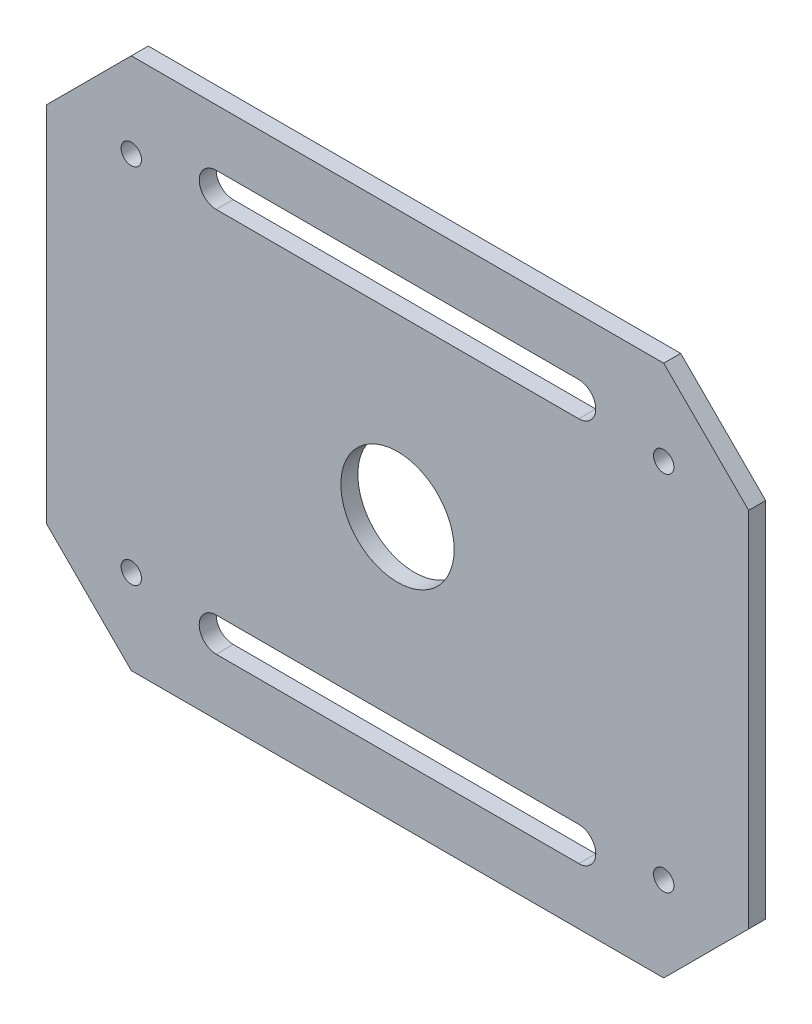
ISO-10303-21;
HEADER;
FILE_DESCRIPTION(('STEP AP214'),'2;1');
FILE_NAME('part.step','',(''),(''),'','','');
FILE_SCHEMA(('AUTOMOTIVE_DESIGN { 1 0 10303 214 1 1 1 1 }'));
ENDSEC;
DATA;
#1=APPLICATION_CONTEXT('core data for automotive mechanical design processes');
#2=APPLICATION_PROTOCOL_DEFINITION('international standard','automotive_design',2000,#1);
#3=PRODUCT_CONTEXT('',#1,'mechanical');
#4=PRODUCT('Part','Part','',(#3));
#5=PRODUCT_RELATED_PRODUCT_CATEGORY('part','',(#4));
#6=PRODUCT_DEFINITION_FORMATION('','',#4);
#7=PRODUCT_DEFINITION_CONTEXT('part definition',#1,'design');
#8=PRODUCT_DEFINITION('design','',#6,#7);
#9=PRODUCT_DEFINITION_SHAPE('','',#8);
#10=(LENGTH_UNIT() NAMED_UNIT(*) SI_UNIT(.MILLI.,.METRE.));
#11=(NAMED_UNIT(*) PLANE_ANGLE_UNIT() SI_UNIT($,.RADIAN.));
#12=(NAMED_UNIT(*) SI_UNIT($,.STERADIAN.) SOLID_ANGLE_UNIT());
#13=UNCERTAINTY_MEASURE_WITH_UNIT(LENGTH_MEASURE(1.E-05),#10,'distance_accuracy_value','');
#14=(GEOMETRIC_REPRESENTATION_CONTEXT(3) GLOBAL_UNCERTAINTY_ASSIGNED_CONTEXT((#13)) GLOBAL_UNIT_ASSIGNED_CONTEXT((#10,
#11,#12)) REPRESENTATION_CONTEXT('',''));
#15=CARTESIAN_POINT('',(0.,0.,0.));
#16=DIRECTION('',(0.,0.,1.));
#17=DIRECTION('',(1.,0.,0.));
#18=AXIS2_PLACEMENT_3D('',#15,#16,#17);
#19=CARTESIAN_POINT('',(0.,0.,3.));
#20=DIRECTION('',(0.,0.,1.));
#21=DIRECTION('',(1.,0.,0.));
#22=AXIS2_PLACEMENT_3D('',#19,#20,#21);
#23=PLANE('',#22);
#24=CARTESIAN_POINT('',(-24.9574088553855,-107.544565590663,3.));
#25=DIRECTION('',(0.,0.,1.));
#26=DIRECTION('',(1.,0.,0.));
#27=AXIS2_PLACEMENT_3D('',#24,#25,#26);
#28=CIRCLE('',#27,1.8);
#29=CARTESIAN_POINT('',(-23.1574088553855,-107.544565590663,3.));
#30=VERTEX_POINT('',#29);
#31=EDGE_CURVE('E411',#30,#30,#28,.T.);
#32=ORIENTED_EDGE('',*,*,#31,.F.);
#33=EDGE_LOOP('',(#32));
#34=FACE_BOUND('',#33,.T.);
#35=CARTESIAN_POINT('',(69.0425911446145,-43.5445655906625,3.));
#36=DIRECTION('',(0.,0.,1.));
#37=DIRECTION('',(1.,0.,0.));
#38=AXIS2_PLACEMENT_3D('',#35,#36,#37);
#39=CIRCLE('',#38,1.80000000000001);
#40=CARTESIAN_POINT('',(70.8425911446145,-43.5445655906625,3.));
#41=VERTEX_POINT('',#40);
#42=EDGE_CURVE('E423',#41,#41,#39,.T.);
#43=ORIENTED_EDGE('',*,*,#42,.F.);
#44=EDGE_LOOP('',(#43));
#45=FACE_BOUND('',#44,.T.);
#46=DIRECTION('',(1.,0.,0.));
#47=VECTOR('',#46,1.);
#48=CARTESIAN_POINT('',(54.0509267940495,-112.544565590663,3.));
#49=LINE('',#48,#47);
#50=CARTESIAN_POINT('',(-9.96574450482058,-112.544565590663,3.));
#51=VERTEX_POINT('',#50);
#52=CARTESIAN_POINT('',(54.0509267940495,-112.544565590663,3.));
#53=VERTEX_POINT('',#52);
#54=EDGE_CURVE('E160',#51,#53,#49,.T.);
#55=ORIENTED_EDGE('',*,*,#54,.F.);
#56=CARTESIAN_POINT('',(-9.96574450482058,-109.544565590663,3.));
#57=DIRECTION('',(0.,0.,1.));
#58=DIRECTION('',(1.,0.,0.));
#59=AXIS2_PLACEMENT_3D('',#56,#57,#58);
#60=CIRCLE('',#59,2.99999999999999);
#61=CARTESIAN_POINT('',(-9.96574450482058,-106.544565590663,3.));
#62=VERTEX_POINT('',#61);
#63=EDGE_CURVE('E152',#62,#51,#60,.T.);
#64=ORIENTED_EDGE('',*,*,#63,.F.);
#65=DIRECTION('',(-1.,0.,0.));
#66=VECTOR('',#65,1.);
#67=CARTESIAN_POINT('',(-9.96574450482058,-106.544565590663,3.));
#68=LINE('',#67,#66);
#69=CARTESIAN_POINT('',(54.0509267940495,-106.544565590663,3.));
#70=VERTEX_POINT('',#69);
#71=EDGE_CURVE('E175',#70,#62,#68,.T.);
#72=ORIENTED_EDGE('',*,*,#71,.F.);
#73=CARTESIAN_POINT('',(54.0509267940496,-109.544565590663,3.));
#74=DIRECTION('',(0.,0.,1.));
#75=DIRECTION('',(1.,0.,0.));
#76=AXIS2_PLACEMENT_3D('',#73,#74,#75);
#77=CIRCLE('',#76,2.99999999999999);
#78=EDGE_CURVE('E173',#53,#70,#77,.T.);
#79=ORIENTED_EDGE('',*,*,#78,.F.);
#80=EDGE_LOOP('',(#55,#64,#72,#79));
#81=FACE_BOUND('',#80,.T.);
#82=DIRECTION('',(1.,0.,0.));
#83=VECTOR('',#82,1.);
#84=CARTESIAN_POINT('',(-9.95740885538553,-44.5445655906625,3.));
#85=LINE('',#84,#83);
#86=CARTESIAN_POINT('',(-9.95740885538553,-44.5445655906625,3.));
#87=VERTEX_POINT('',#86);
#88=CARTESIAN_POINT('',(54.0425911446145,-44.5445655906625,3.));
#89=VERTEX_POINT('',#88);
#90=EDGE_CURVE('E193',#87,#89,#85,.T.);
#91=ORIENTED_EDGE('',*,*,#90,.F.);
#92=CARTESIAN_POINT('',(-9.95740885538553,-41.5445655906625,3.));
#93=DIRECTION('',(0.,0.,1.));
#94=DIRECTION('',(1.,0.,0.));
#95=AXIS2_PLACEMENT_3D('',#92,#93,#94);
#96=CIRCLE('',#95,2.99999999999999);
#97=CARTESIAN_POINT('',(-9.95740885538553,-38.5445655906625,3.));
#98=VERTEX_POINT('',#97);
#99=EDGE_CURVE('E191',#98,#87,#96,.T.);
#100=ORIENTED_EDGE('',*,*,#99,.F.);
#101=DIRECTION('',(-1.,0.,0.));
#102=VECTOR('',#101,1.);
#103=CARTESIAN_POINT('',(-9.95740885538553,-38.5445655906625,3.));
#104=LINE('',#103,#102);
#105=CARTESIAN_POINT('',(54.0425911446145,-38.5445655906625,3.));
#106=VERTEX_POINT('',#105);
#107=EDGE_CURVE('E199',#106,#98,#104,.T.);
#108=ORIENTED_EDGE('',*,*,#107,.F.);
#109=CARTESIAN_POINT('',(54.0425911446145,-41.5445655906625,3.));
#110=DIRECTION('',(0.,0.,1.));
#111=DIRECTION('',(1.,0.,0.));
#112=AXIS2_PLACEMENT_3D('',#109,#110,#111);
#113=CIRCLE('',#112,2.99999999999999);
#114=EDGE_CURVE('E196',#89,#106,#113,.T.);
#115=ORIENTED_EDGE('',*,*,#114,.F.);
#116=EDGE_LOOP('',(#91,#100,#108,#115));
#117=FACE_BOUND('',#116,.T.);
#118=DIRECTION('',(0.,-1.,0.));
#119=VECTOR('',#118,1.);
#120=CARTESIAN_POINT('',(-39.9574088553855,-43.5445655906625,3.));
#121=LINE('',#120,#119);
#122=CARTESIAN_POINT('',(-39.9574088553855,-43.5445655906625,3.));
#123=VERTEX_POINT('',#122);
#124=CARTESIAN_POINT('',(-39.9574088553855,-107.544565590663,3.));
#125=VERTEX_POINT('',#124);
#126=EDGE_CURVE('E222',#123,#125,#121,.T.);
#127=ORIENTED_EDGE('',*,*,#126,.T.);
#128=DIRECTION('',(0.707106781186548,-0.707106781186547,0.));
#129=VECTOR('',#128,1.);
#130=CARTESIAN_POINT('',(-39.9574088553855,-107.544565590663,3.));
#131=LINE('',#130,#129);
#132=CARTESIAN_POINT('',(-24.9574088553855,-122.544565590663,3.));
#133=VERTEX_POINT('',#132);
#134=EDGE_CURVE('E225',#125,#133,#131,.T.);
#135=ORIENTED_EDGE('',*,*,#134,.T.);
#136=DIRECTION('',(1.,0.,0.));
#137=VECTOR('',#136,1.);
#138=CARTESIAN_POINT('',(-24.9574088553855,-122.544565590663,3.));
#139=LINE('',#138,#137);
#140=CARTESIAN_POINT('',(69.0425911446145,-122.544565590663,3.));
#141=VERTEX_POINT('',#140);
#142=EDGE_CURVE('E228',#133,#141,#139,.T.);
#143=ORIENTED_EDGE('',*,*,#142,.T.);
#144=DIRECTION('',(0.707106781186547,0.707106781186548,0.));
#145=VECTOR('',#144,1.);
#146=CARTESIAN_POINT('',(69.0425911446145,-122.544565590663,3.));
#147=LINE('',#146,#145);
#148=CARTESIAN_POINT('',(84.0425911446145,-107.544565590663,3.));
#149=VERTEX_POINT('',#148);
#150=EDGE_CURVE('E230',#141,#149,#147,.T.);
#151=ORIENTED_EDGE('',*,*,#150,.T.);
#152=DIRECTION('',(0.,1.,0.));
#153=VECTOR('',#152,1.);
#154=CARTESIAN_POINT('',(84.0425911446145,-43.5445655906625,3.));
#155=LINE('',#154,#153);
#156=CARTESIAN_POINT('',(84.0425911446145,-43.5445655906625,3.));
#157=VERTEX_POINT('',#156);
#158=EDGE_CURVE('E232',#149,#157,#155,.T.);
#159=ORIENTED_EDGE('',*,*,#158,.T.);
#160=DIRECTION('',(-0.707106781186547,0.707106781186548,0.));
#161=VECTOR('',#160,1.);
#162=CARTESIAN_POINT('',(69.0425911446145,-28.5445655906625,3.));
#163=LINE('',#162,#161);
#164=CARTESIAN_POINT('',(69.0425911446145,-28.5445655906625,3.));
#165=VERTEX_POINT('',#164);
#166=EDGE_CURVE('E234',#157,#165,#163,.T.);
#167=ORIENTED_EDGE('',*,*,#166,.T.);
#168=DIRECTION('',(-1.,0.,0.));
#169=VECTOR('',#168,1.);
#170=CARTESIAN_POINT('',(-24.9574088553855,-28.5445655906625,3.));
#171=LINE('',#170,#169);
#172=CARTESIAN_POINT('',(-24.9574088553855,-28.5445655906625,3.));
#173=VERTEX_POINT('',#172);
#174=EDGE_CURVE('E236',#165,#173,#171,.T.);
#175=ORIENTED_EDGE('',*,*,#174,.T.);
#176=DIRECTION('',(-0.707106781186547,-0.707106781186548,0.));
#177=VECTOR('',#176,1.);
#178=CARTESIAN_POINT('',(-39.9574088553855,-43.5445655906625,3.));
#179=LINE('',#178,#177);
#180=EDGE_CURVE('E238',#173,#123,#179,.T.);
#181=ORIENTED_EDGE('',*,*,#180,.T.);
#182=EDGE_LOOP('',(#127,#135,#143,#151,#159,#167,#175,#181));
#183=FACE_BOUND('',#182,.T.);
#184=CARTESIAN_POINT('',(-24.9574088553855,-43.5445655906625,3.));
#185=DIRECTION('',(0.,0.,1.));
#186=DIRECTION('',(1.,0.,0.));
#187=AXIS2_PLACEMENT_3D('',#184,#185,#186);
#188=CIRCLE('',#187,1.8);
#189=CARTESIAN_POINT('',(-23.1574088553855,-43.5445655906625,3.));
#190=VERTEX_POINT('',#189);
#191=EDGE_CURVE('E181',#190,#190,#188,.T.);
#192=ORIENTED_EDGE('',*,*,#191,.F.);
#193=EDGE_LOOP('',(#192));
#194=FACE_BOUND('',#193,.T.);
#195=CARTESIAN_POINT('',(69.0425911446145,-107.544565590663,3.));
#196=DIRECTION('',(0.,0.,1.));
#197=DIRECTION('',(1.,0.,0.));
#198=AXIS2_PLACEMENT_3D('',#195,#196,#197);
#199=CIRCLE('',#198,1.8);
#200=CARTESIAN_POINT('',(70.8425911446145,-107.544565590663,3.));
#201=VERTEX_POINT('',#200);
#202=EDGE_CURVE('E417',#201,#201,#199,.T.);
#203=ORIENTED_EDGE('',*,*,#202,.F.);
#204=EDGE_LOOP('',(#203));
#205=FACE_BOUND('',#204,.T.);
#206=CARTESIAN_POINT('',(22.0425911446145,-75.5445655906625,3.));
#207=DIRECTION('',(0.,0.,1.));
#208=DIRECTION('',(1.,0.,0.));
#209=AXIS2_PLACEMENT_3D('',#206,#207,#208);
#210=CIRCLE('',#209,10.);
#211=CARTESIAN_POINT('',(32.0425911446145,-75.5445655906625,3.));
#212=VERTEX_POINT('',#211);
#213=EDGE_CURVE('E402',#212,#212,#210,.T.);
#214=ORIENTED_EDGE('',*,*,#213,.F.);
#215=EDGE_LOOP('',(#214));
#216=FACE_BOUND('',#215,.T.);
#217=ADVANCED_FACE('F39',(#34,#45,#81,#117,#183,#194,#205,#216),#23,.T.);
#218=CARTESIAN_POINT('',(0.,0.,0.));
#219=DIRECTION('',(0.,0.,1.));
#220=DIRECTION('',(1.,0.,0.));
#221=AXIS2_PLACEMENT_3D('',#218,#219,#220);
#222=PLANE('',#221);
#223=CARTESIAN_POINT('',(-9.95740885538553,-41.5445655906625,0.));
#224=DIRECTION('',(0.,0.,1.));
#225=DIRECTION('',(1.,0.,0.));
#226=AXIS2_PLACEMENT_3D('',#223,#224,#225);
#227=CIRCLE('',#226,2.99999999999999);
#228=CARTESIAN_POINT('',(-9.95740885538553,-38.5445655906625,0.));
#229=VERTEX_POINT('',#228);
#230=CARTESIAN_POINT('',(-9.95740885538553,-44.5445655906625,0.));
#231=VERTEX_POINT('',#230);
#232=EDGE_CURVE('E168',#229,#231,#227,.T.);
#233=ORIENTED_EDGE('',*,*,#232,.T.);
#234=DIRECTION('',(1.,0.,0.));
#235=VECTOR('',#234,1.);
#236=CARTESIAN_POINT('',(-9.95740885538553,-44.5445655906625,0.));
#237=LINE('',#236,#235);
#238=CARTESIAN_POINT('',(54.0425911446145,-44.5445655906625,0.));
#239=VERTEX_POINT('',#238);
#240=EDGE_CURVE('E204',#231,#239,#237,.T.);
#241=ORIENTED_EDGE('',*,*,#240,.T.);
#242=CARTESIAN_POINT('',(54.0425911446145,-41.5445655906625,0.));
#243=DIRECTION('',(0.,0.,1.));
#244=DIRECTION('',(1.,0.,0.));
#245=AXIS2_PLACEMENT_3D('',#242,#243,#244);
#246=CIRCLE('',#245,2.99999999999999);
#247=CARTESIAN_POINT('',(54.0425911446145,-38.5445655906625,0.));
#248=VERTEX_POINT('',#247);
#249=EDGE_CURVE('E207',#239,#248,#246,.T.);
#250=ORIENTED_EDGE('',*,*,#249,.T.);
#251=DIRECTION('',(-1.,0.,0.));
#252=VECTOR('',#251,1.);
#253=CARTESIAN_POINT('',(-9.95740885538553,-38.5445655906625,0.));
#254=LINE('',#253,#252);
#255=EDGE_CURVE('E194',#248,#229,#254,.T.);
#256=ORIENTED_EDGE('',*,*,#255,.T.);
#257=EDGE_LOOP('',(#233,#241,#250,#256));
#258=FACE_BOUND('',#257,.T.);
#259=DIRECTION('',(0.,-1.,0.));
#260=VECTOR('',#259,1.);
#261=CARTESIAN_POINT('',(-39.9574088553855,-43.5445655906625,0.));
#262=LINE('',#261,#260);
#263=CARTESIAN_POINT('',(-39.9574088553855,-43.5445655906625,0.));
#264=VERTEX_POINT('',#263);
#265=CARTESIAN_POINT('',(-39.9574088553855,-107.544565590663,0.));
#266=VERTEX_POINT('',#265);
#267=EDGE_CURVE('E221',#264,#266,#262,.T.);
#268=ORIENTED_EDGE('',*,*,#267,.F.);
#269=DIRECTION('',(-0.707106781186547,-0.707106781186548,0.));
#270=VECTOR('',#269,1.);
#271=CARTESIAN_POINT('',(-39.9574088553855,-43.5445655906625,0.));
#272=LINE('',#271,#270);
#273=CARTESIAN_POINT('',(-24.9574088553855,-28.5445655906625,0.));
#274=VERTEX_POINT('',#273);
#275=EDGE_CURVE('E226',#274,#264,#272,.T.);
#276=ORIENTED_EDGE('',*,*,#275,.F.);
#277=DIRECTION('',(-1.,0.,0.));
#278=VECTOR('',#277,1.);
#279=CARTESIAN_POINT('',(-24.9574088553855,-28.5445655906625,0.));
#280=LINE('',#279,#278);
#281=CARTESIAN_POINT('',(69.0425911446145,-28.5445655906625,0.));
#282=VERTEX_POINT('',#281);
#283=EDGE_CURVE('E253',#282,#274,#280,.T.);
#284=ORIENTED_EDGE('',*,*,#283,.F.);
#285=DIRECTION('',(-0.707106781186547,0.707106781186548,0.));
#286=VECTOR('',#285,1.);
#287=CARTESIAN_POINT('',(69.0425911446145,-28.5445655906625,0.));
#288=LINE('',#287,#286);
#289=CARTESIAN_POINT('',(84.0425911446145,-43.5445655906625,0.));
#290=VERTEX_POINT('',#289);
#291=EDGE_CURVE('E251',#290,#282,#288,.T.);
#292=ORIENTED_EDGE('',*,*,#291,.F.);
#293=DIRECTION('',(0.,1.,0.));
#294=VECTOR('',#293,1.);
#295=CARTESIAN_POINT('',(84.0425911446145,-43.5445655906625,0.));
#296=LINE('',#295,#294);
#297=CARTESIAN_POINT('',(84.0425911446145,-107.544565590663,0.));
#298=VERTEX_POINT('',#297);
#299=EDGE_CURVE('E249',#298,#290,#296,.T.);
#300=ORIENTED_EDGE('',*,*,#299,.F.);
#301=DIRECTION('',(0.707106781186547,0.707106781186548,0.));
#302=VECTOR('',#301,1.);
#303=CARTESIAN_POINT('',(69.0425911446145,-122.544565590663,0.));
#304=LINE('',#303,#302);
#305=CARTESIAN_POINT('',(69.0425911446145,-122.544565590663,0.));
#306=VERTEX_POINT('',#305);
#307=EDGE_CURVE('E247',#306,#298,#304,.T.);
#308=ORIENTED_EDGE('',*,*,#307,.F.);
#309=DIRECTION('',(1.,0.,0.));
#310=VECTOR('',#309,1.);
#311=CARTESIAN_POINT('',(-24.9574088553855,-122.544565590663,0.));
#312=LINE('',#311,#310);
#313=CARTESIAN_POINT('',(-24.9574088553855,-122.544565590663,0.));
#314=VERTEX_POINT('',#313);
#315=EDGE_CURVE('E245',#314,#306,#312,.T.);
#316=ORIENTED_EDGE('',*,*,#315,.F.);
#317=DIRECTION('',(0.707106781186548,-0.707106781186547,0.));
#318=VECTOR('',#317,1.);
#319=CARTESIAN_POINT('',(-39.9574088553855,-107.544565590663,0.));
#320=LINE('',#319,#318);
#321=EDGE_CURVE('E243',#266,#314,#320,.T.);
#322=ORIENTED_EDGE('',*,*,#321,.F.);
#323=EDGE_LOOP('',(#268,#276,#284,#292,#300,#308,#316,#322));
#324=FACE_BOUND('',#323,.T.);
#325=CARTESIAN_POINT('',(-9.96574450482058,-109.544565590663,0.));
#326=DIRECTION('',(0.,0.,1.));
#327=DIRECTION('',(1.,0.,0.));
#328=AXIS2_PLACEMENT_3D('',#325,#326,#327);
#329=CIRCLE('',#328,2.99999999999999);
#330=CARTESIAN_POINT('',(-9.96574450482058,-106.544565590663,0.));
#331=VERTEX_POINT('',#330);
#332=CARTESIAN_POINT('',(-9.96574450482058,-112.544565590663,0.));
#333=VERTEX_POINT('',#332);
#334=EDGE_CURVE('E62',#331,#333,#329,.T.);
#335=ORIENTED_EDGE('',*,*,#334,.T.);
#336=DIRECTION('',(1.,0.,0.));
#337=VECTOR('',#336,1.);
#338=CARTESIAN_POINT('',(54.0509267940495,-112.544565590663,0.));
#339=LINE('',#338,#337);
#340=CARTESIAN_POINT('',(54.0509267940495,-112.544565590663,0.));
#341=VERTEX_POINT('',#340);
#342=EDGE_CURVE('E167',#333,#341,#339,.T.);
#343=ORIENTED_EDGE('',*,*,#342,.T.);
#344=CARTESIAN_POINT('',(54.0509267940496,-109.544565590663,0.));
#345=DIRECTION('',(0.,0.,1.));
#346=DIRECTION('',(1.,0.,0.));
#347=AXIS2_PLACEMENT_3D('',#344,#345,#346);
#348=CIRCLE('',#347,2.99999999999999);
#349=CARTESIAN_POINT('',(54.0509267940495,-106.544565590663,0.));
#350=VERTEX_POINT('',#349);
#351=EDGE_CURVE('E183',#341,#350,#348,.T.);
#352=ORIENTED_EDGE('',*,*,#351,.T.);
#353=DIRECTION('',(-1.,0.,0.));
#354=VECTOR('',#353,1.);
#355=CARTESIAN_POINT('',(-9.96574450482058,-106.544565590663,0.));
#356=LINE('',#355,#354);
#357=EDGE_CURVE('E161',#350,#331,#356,.T.);
#358=ORIENTED_EDGE('',*,*,#357,.T.);
#359=EDGE_LOOP('',(#335,#343,#352,#358));
#360=FACE_BOUND('',#359,.T.);
#361=CARTESIAN_POINT('',(-24.9574088553855,-43.5445655906625,0.));
#362=DIRECTION('',(0.,0.,1.));
#363=DIRECTION('',(1.,0.,0.));
#364=AXIS2_PLACEMENT_3D('',#361,#362,#363);
#365=CIRCLE('',#364,1.8);
#366=CARTESIAN_POINT('',(-23.1574088553855,-43.5445655906625,0.));
#367=VERTEX_POINT('',#366);
#368=EDGE_CURVE('E426',#367,#367,#365,.T.);
#369=ORIENTED_EDGE('',*,*,#368,.T.);
#370=EDGE_LOOP('',(#369));
#371=FACE_BOUND('',#370,.T.);
#372=CARTESIAN_POINT('',(69.0425911446145,-43.5445655906625,0.));
#373=DIRECTION('',(0.,0.,1.));
#374=DIRECTION('',(1.,0.,0.));
#375=AXIS2_PLACEMENT_3D('',#372,#373,#374);
#376=CIRCLE('',#375,1.80000000000001);
#377=CARTESIAN_POINT('',(70.8425911446145,-43.5445655906625,0.));
#378=VERTEX_POINT('',#377);
#379=EDGE_CURVE('E420',#378,#378,#376,.T.);
#380=ORIENTED_EDGE('',*,*,#379,.T.);
#381=EDGE_LOOP('',(#380));
#382=FACE_BOUND('',#381,.T.);
#383=CARTESIAN_POINT('',(69.0425911446145,-107.544565590663,0.));
#384=DIRECTION('',(0.,0.,1.));
#385=DIRECTION('',(1.,0.,0.));
#386=AXIS2_PLACEMENT_3D('',#383,#384,#385);
#387=CIRCLE('',#386,1.8);
#388=CARTESIAN_POINT('',(70.8425911446145,-107.544565590663,0.));
#389=VERTEX_POINT('',#388);
#390=EDGE_CURVE('E414',#389,#389,#387,.T.);
#391=ORIENTED_EDGE('',*,*,#390,.T.);
#392=EDGE_LOOP('',(#391));
#393=FACE_BOUND('',#392,.T.);
#394=CARTESIAN_POINT('',(-24.9574088553855,-107.544565590663,0.));
#395=DIRECTION('',(0.,0.,1.));
#396=DIRECTION('',(1.,0.,0.));
#397=AXIS2_PLACEMENT_3D('',#394,#395,#396);
#398=CIRCLE('',#397,1.8);
#399=CARTESIAN_POINT('',(-23.1574088553855,-107.544565590663,0.));
#400=VERTEX_POINT('',#399);
#401=EDGE_CURVE('E408',#400,#400,#398,.T.);
#402=ORIENTED_EDGE('',*,*,#401,.T.);
#403=EDGE_LOOP('',(#402));
#404=FACE_BOUND('',#403,.T.);
#405=CARTESIAN_POINT('',(22.0425911446145,-75.5445655906625,0.));
#406=DIRECTION('',(0.,0.,1.));
#407=DIRECTION('',(1.,0.,0.));
#408=AXIS2_PLACEMENT_3D('',#405,#406,#407);
#409=CIRCLE('',#408,10.);
#410=CARTESIAN_POINT('',(32.0425911446145,-75.5445655906625,0.));
#411=VERTEX_POINT('',#410);
#412=EDGE_CURVE('E405',#411,#411,#409,.T.);
#413=ORIENTED_EDGE('',*,*,#412,.T.);
#414=EDGE_LOOP('',(#413));
#415=FACE_BOUND('',#414,.T.);
#416=ADVANCED_FACE('F283',(#258,#324,#360,#371,#382,#393,#404,#415),#222,.F.);
#417=CARTESIAN_POINT('',(-39.9574088553855,-43.5445655906625,3.));
#418=DIRECTION('',(1.,0.,0.));
#419=DIRECTION('',(0.,0.,-1.));
#420=AXIS2_PLACEMENT_3D('',#417,#418,#419);
#421=PLANE('',#420);
#422=ORIENTED_EDGE('',*,*,#267,.T.);
#423=DIRECTION('',(0.,0.,-1.));
#424=VECTOR('',#423,1.);
#425=CARTESIAN_POINT('',(-39.9574088553855,-107.544565590663,3.));
#426=LINE('',#425,#424);
#427=EDGE_CURVE('E11',#125,#266,#426,.T.);
#428=ORIENTED_EDGE('',*,*,#427,.F.);
#429=ORIENTED_EDGE('',*,*,#126,.F.);
#430=DIRECTION('',(0.,0.,-1.));
#431=VECTOR('',#430,1.);
#432=CARTESIAN_POINT('',(-39.9574088553855,-43.5445655906625,3.));
#433=LINE('',#432,#431);
#434=EDGE_CURVE('E240',#123,#264,#433,.T.);
#435=ORIENTED_EDGE('',*,*,#434,.T.);
#436=EDGE_LOOP('',(#422,#428,#429,#435));
#437=FACE_BOUND('',#436,.T.);
#438=ADVANCED_FACE('F41',(#437),#421,.F.);
#439=CARTESIAN_POINT('',(-39.9574088553855,-107.544565590663,3.));
#440=DIRECTION('',(0.707106781186547,0.707106781186548,0.));
#441=DIRECTION('',(-0.707106781186548,0.707106781186547,0.));
#442=AXIS2_PLACEMENT_3D('',#439,#440,#441);
#443=PLANE('',#442);
#444=ORIENTED_EDGE('',*,*,#321,.T.);
#445=DIRECTION('',(0.,0.,-1.));
#446=VECTOR('',#445,1.);
#447=CARTESIAN_POINT('',(-24.9574088553855,-122.544565590663,3.));
#448=LINE('',#447,#446);
#449=EDGE_CURVE('E47',#133,#314,#448,.T.);
#450=ORIENTED_EDGE('',*,*,#449,.F.);
#451=ORIENTED_EDGE('',*,*,#134,.F.);
#452=ORIENTED_EDGE('',*,*,#427,.T.);
#453=EDGE_LOOP('',(#444,#450,#451,#452));
#454=FACE_BOUND('',#453,.T.);
#455=ADVANCED_FACE('F301',(#454),#443,.F.);
#456=CARTESIAN_POINT('',(-24.9574088553855,-122.544565590663,3.));
#457=DIRECTION('',(0.,1.,0.));
#458=DIRECTION('',(0.,0.,1.));
#459=AXIS2_PLACEMENT_3D('',#456,#457,#458);
#460=PLANE('',#459);
#461=ORIENTED_EDGE('',*,*,#315,.T.);
#462=DIRECTION('',(0.,0.,-1.));
#463=VECTOR('',#462,1.);
#464=CARTESIAN_POINT('',(69.0425911446145,-122.544565590663,3.));
#465=LINE('',#464,#463);
#466=EDGE_CURVE('E270',#141,#306,#465,.T.);
#467=ORIENTED_EDGE('',*,*,#466,.F.);
#468=ORIENTED_EDGE('',*,*,#142,.F.);
#469=ORIENTED_EDGE('',*,*,#449,.T.);
#470=EDGE_LOOP('',(#461,#467,#468,#469));
#471=FACE_BOUND('',#470,.T.);
#472=ADVANCED_FACE('F277',(#471),#460,.F.);
#473=CARTESIAN_POINT('',(69.0425911446145,-122.544565590663,3.));
#474=DIRECTION('',(-0.707106781186548,0.707106781186547,0.));
#475=DIRECTION('',(-0.707106781186547,-0.707106781186548,0.));
#476=AXIS2_PLACEMENT_3D('',#473,#474,#475);
#477=PLANE('',#476);
#478=ORIENTED_EDGE('',*,*,#307,.T.);
#479=DIRECTION('',(0.,0.,-1.));
#480=VECTOR('',#479,1.);
#481=CARTESIAN_POINT('',(84.0425911446145,-107.544565590663,3.));
#482=LINE('',#481,#480);
#483=EDGE_CURVE('E267',#149,#298,#482,.T.);
#484=ORIENTED_EDGE('',*,*,#483,.F.);
#485=ORIENTED_EDGE('',*,*,#150,.F.);
#486=ORIENTED_EDGE('',*,*,#466,.T.);
#487=EDGE_LOOP('',(#478,#484,#485,#486));
#488=FACE_BOUND('',#487,.T.);
#489=ADVANCED_FACE('F289',(#488),#477,.F.);
#490=CARTESIAN_POINT('',(84.0425911446145,-43.5445655906625,3.));
#491=DIRECTION('',(-1.,0.,0.));
#492=DIRECTION('',(0.,0.,1.));
#493=AXIS2_PLACEMENT_3D('',#490,#491,#492);
#494=PLANE('',#493);
#495=ORIENTED_EDGE('',*,*,#299,.T.);
#496=DIRECTION('',(0.,0.,-1.));
#497=VECTOR('',#496,1.);
#498=CARTESIAN_POINT('',(84.0425911446145,-43.5445655906625,3.));
#499=LINE('',#498,#497);
#500=EDGE_CURVE('E264',#157,#290,#499,.T.);
#501=ORIENTED_EDGE('',*,*,#500,.F.);
#502=ORIENTED_EDGE('',*,*,#158,.F.);
#503=ORIENTED_EDGE('',*,*,#483,.T.);
#504=EDGE_LOOP('',(#495,#501,#502,#503));
#505=FACE_BOUND('',#504,.T.);
#506=ADVANCED_FACE('F293',(#505),#494,.F.);
#507=CARTESIAN_POINT('',(69.0425911446145,-28.5445655906625,3.));
#508=DIRECTION('',(-0.707106781186548,-0.707106781186547,0.));
#509=DIRECTION('',(0.707106781186547,-0.707106781186548,0.));
#510=AXIS2_PLACEMENT_3D('',#507,#508,#509);
#511=PLANE('',#510);
#512=ORIENTED_EDGE('',*,*,#291,.T.);
#513=DIRECTION('',(0.,0.,-1.));
#514=VECTOR('',#513,1.);
#515=CARTESIAN_POINT('',(69.0425911446145,-28.5445655906625,3.));
#516=LINE('',#515,#514);
#517=EDGE_CURVE('E261',#165,#282,#516,.T.);
#518=ORIENTED_EDGE('',*,*,#517,.F.);
#519=ORIENTED_EDGE('',*,*,#166,.F.);
#520=ORIENTED_EDGE('',*,*,#500,.T.);
#521=EDGE_LOOP('',(#512,#518,#519,#520));
#522=FACE_BOUND('',#521,.T.);
#523=ADVANCED_FACE('F314',(#522),#511,.F.);
#524=CARTESIAN_POINT('',(-24.9574088553855,-28.5445655906625,3.));
#525=DIRECTION('',(0.,-1.,0.));
#526=DIRECTION('',(1.,0.,0.));
#527=AXIS2_PLACEMENT_3D('',#524,#525,#526);
#528=PLANE('',#527);
#529=ORIENTED_EDGE('',*,*,#283,.T.);
#530=DIRECTION('',(0.,0.,-1.));
#531=VECTOR('',#530,1.);
#532=CARTESIAN_POINT('',(-24.9574088553855,-28.5445655906625,3.));
#533=LINE('',#532,#531);
#534=EDGE_CURVE('E258',#173,#274,#533,.T.);
#535=ORIENTED_EDGE('',*,*,#534,.F.);
#536=ORIENTED_EDGE('',*,*,#174,.F.);
#537=ORIENTED_EDGE('',*,*,#517,.T.);
#538=EDGE_LOOP('',(#529,#535,#536,#537));
#539=FACE_BOUND('',#538,.T.);
#540=ADVANCED_FACE('F312',(#539),#528,.F.);
#541=CARTESIAN_POINT('',(-39.9574088553855,-43.5445655906625,3.));
#542=DIRECTION('',(0.707106781186548,-0.707106781186547,0.));
#543=DIRECTION('',(0.707106781186547,0.707106781186548,0.));
#544=AXIS2_PLACEMENT_3D('',#541,#542,#543);
#545=PLANE('',#544);
#546=ORIENTED_EDGE('',*,*,#275,.T.);
#547=ORIENTED_EDGE('',*,*,#434,.F.);
#548=ORIENTED_EDGE('',*,*,#180,.F.);
#549=ORIENTED_EDGE('',*,*,#534,.T.);
#550=EDGE_LOOP('',(#546,#547,#548,#549));
#551=FACE_BOUND('',#550,.T.);
#552=ADVANCED_FACE('F307',(#551),#545,.F.);
#553=CARTESIAN_POINT('',(-9.95740885538553,-41.5445655906625,3.));
#554=DIRECTION('',(0.,0.,-1.));
#555=DIRECTION('',(-1.,0.,0.));
#556=AXIS2_PLACEMENT_3D('',#553,#554,#555);
#557=CYLINDRICAL_SURFACE('',#556,2.99999999999999);
#558=ORIENTED_EDGE('',*,*,#232,.F.);
#559=DIRECTION('',(0.,0.,-1.));
#560=VECTOR('',#559,1.);
#561=CARTESIAN_POINT('',(-9.95740885538553,-38.5445655906625,3.));
#562=LINE('',#561,#560);
#563=EDGE_CURVE('E201',#98,#229,#562,.T.);
#564=ORIENTED_EDGE('',*,*,#563,.F.);
#565=ORIENTED_EDGE('',*,*,#99,.T.);
#566=DIRECTION('',(0.,0.,-1.));
#567=VECTOR('',#566,1.);
#568=CARTESIAN_POINT('',(-9.95740885538553,-44.5445655906625,3.));
#569=LINE('',#568,#567);
#570=EDGE_CURVE('E218',#87,#231,#569,.T.);
#571=ORIENTED_EDGE('',*,*,#570,.T.);
#572=EDGE_LOOP('',(#558,#564,#565,#571));
#573=FACE_BOUND('',#572,.T.);
#574=ADVANCED_FACE('F334',(#573),#557,.F.);
#575=CARTESIAN_POINT('',(-9.95740885538553,-44.5445655906625,3.));
#576=DIRECTION('',(0.,1.,0.));
#577=DIRECTION('',(0.,0.,1.));
#578=AXIS2_PLACEMENT_3D('',#575,#576,#577);
#579=PLANE('',#578);
#580=ORIENTED_EDGE('',*,*,#240,.F.);
#581=ORIENTED_EDGE('',*,*,#570,.F.);
#582=ORIENTED_EDGE('',*,*,#90,.T.);
#583=DIRECTION('',(0.,0.,-1.));
#584=VECTOR('',#583,1.);
#585=CARTESIAN_POINT('',(54.0425911446145,-44.5445655906625,3.));
#586=LINE('',#585,#584);
#587=EDGE_CURVE('E216',#89,#239,#586,.T.);
#588=ORIENTED_EDGE('',*,*,#587,.T.);
#589=EDGE_LOOP('',(#580,#581,#582,#588));
#590=FACE_BOUND('',#589,.T.);
#591=ADVANCED_FACE('F341',(#590),#579,.T.);
#592=CARTESIAN_POINT('',(54.0425911446145,-41.5445655906625,3.));
#593=DIRECTION('',(0.,0.,-1.));
#594=DIRECTION('',(-1.,0.,0.));
#595=AXIS2_PLACEMENT_3D('',#592,#593,#594);
#596=CYLINDRICAL_SURFACE('',#595,2.99999999999999);
#597=ORIENTED_EDGE('',*,*,#249,.F.);
#598=ORIENTED_EDGE('',*,*,#587,.F.);
#599=ORIENTED_EDGE('',*,*,#114,.T.);
#600=DIRECTION('',(0.,0.,-1.));
#601=VECTOR('',#600,1.);
#602=CARTESIAN_POINT('',(54.0425911446145,-38.5445655906625,3.));
#603=LINE('',#602,#601);
#604=EDGE_CURVE('E214',#106,#248,#603,.T.);
#605=ORIENTED_EDGE('',*,*,#604,.T.);
#606=EDGE_LOOP('',(#597,#598,#599,#605));
#607=FACE_BOUND('',#606,.T.);
#608=ADVANCED_FACE('F346',(#607),#596,.F.);
#609=CARTESIAN_POINT('',(-9.95740885538553,-38.5445655906625,3.));
#610=DIRECTION('',(0.,-1.,0.));
#611=DIRECTION('',(1.,0.,0.));
#612=AXIS2_PLACEMENT_3D('',#609,#610,#611);
#613=PLANE('',#612);
#614=ORIENTED_EDGE('',*,*,#255,.F.);
#615=ORIENTED_EDGE('',*,*,#604,.F.);
#616=ORIENTED_EDGE('',*,*,#107,.T.);
#617=ORIENTED_EDGE('',*,*,#563,.T.);
#618=EDGE_LOOP('',(#614,#615,#616,#617));
#619=FACE_BOUND('',#618,.T.);
#620=ADVANCED_FACE('F353',(#619),#613,.T.);
#621=CARTESIAN_POINT('',(-9.96574450482058,-109.544565590663,3.));
#622=DIRECTION('',(0.,0.,-1.));
#623=DIRECTION('',(-1.,0.,0.));
#624=AXIS2_PLACEMENT_3D('',#621,#622,#623);
#625=CYLINDRICAL_SURFACE('',#624,2.99999999999999);
#626=ORIENTED_EDGE('',*,*,#334,.F.);
#627=DIRECTION('',(0.,0.,-1.));
#628=VECTOR('',#627,1.);
#629=CARTESIAN_POINT('',(-9.96574450482058,-106.544565590663,3.));
#630=LINE('',#629,#628);
#631=EDGE_CURVE('E156',#62,#331,#630,.T.);
#632=ORIENTED_EDGE('',*,*,#631,.F.);
#633=ORIENTED_EDGE('',*,*,#63,.T.);
#634=DIRECTION('',(0.,0.,-1.));
#635=VECTOR('',#634,1.);
#636=CARTESIAN_POINT('',(-9.96574450482058,-112.544565590663,3.));
#637=LINE('',#636,#635);
#638=EDGE_CURVE('E155',#51,#333,#637,.T.);
#639=ORIENTED_EDGE('',*,*,#638,.T.);
#640=EDGE_LOOP('',(#626,#632,#633,#639));
#641=FACE_BOUND('',#640,.T.);
#642=ADVANCED_FACE('F154',(#641),#625,.F.);
#643=CARTESIAN_POINT('',(54.0509267940495,-112.544565590663,3.));
#644=DIRECTION('',(0.,1.,0.));
#645=DIRECTION('',(0.,0.,1.));
#646=AXIS2_PLACEMENT_3D('',#643,#644,#645);
#647=PLANE('',#646);
#648=ORIENTED_EDGE('',*,*,#342,.F.);
#649=ORIENTED_EDGE('',*,*,#638,.F.);
#650=ORIENTED_EDGE('',*,*,#54,.T.);
#651=DIRECTION('',(0.,0.,-1.));
#652=VECTOR('',#651,1.);
#653=CARTESIAN_POINT('',(54.0509267940495,-112.544565590663,3.));
#654=LINE('',#653,#652);
#655=EDGE_CURVE('E169',#53,#341,#654,.T.);
#656=ORIENTED_EDGE('',*,*,#655,.T.);
#657=EDGE_LOOP('',(#648,#649,#650,#656));
#658=FACE_BOUND('',#657,.T.);
#659=ADVANCED_FACE('F164',(#658),#647,.T.);
#660=CARTESIAN_POINT('',(54.0509267940496,-109.544565590663,3.));
#661=DIRECTION('',(0.,0.,-1.));
#662=DIRECTION('',(-1.,0.,0.));
#663=AXIS2_PLACEMENT_3D('',#660,#661,#662);
#664=CYLINDRICAL_SURFACE('',#663,2.99999999999999);
#665=ORIENTED_EDGE('',*,*,#351,.F.);
#666=ORIENTED_EDGE('',*,*,#655,.F.);
#667=ORIENTED_EDGE('',*,*,#78,.T.);
#668=DIRECTION('',(0.,0.,-1.));
#669=VECTOR('',#668,1.);
#670=CARTESIAN_POINT('',(54.0509267940495,-106.544565590663,3.));
#671=LINE('',#670,#669);
#672=EDGE_CURVE('E54',#70,#350,#671,.T.);
#673=ORIENTED_EDGE('',*,*,#672,.T.);
#674=EDGE_LOOP('',(#665,#666,#667,#673));
#675=FACE_BOUND('',#674,.T.);
#676=ADVANCED_FACE('F371',(#675),#664,.F.);
#677=CARTESIAN_POINT('',(-9.96574450482058,-106.544565590663,3.));
#678=DIRECTION('',(0.,-1.,0.));
#679=DIRECTION('',(0.,0.,-1.));
#680=AXIS2_PLACEMENT_3D('',#677,#678,#679);
#681=PLANE('',#680);
#682=ORIENTED_EDGE('',*,*,#357,.F.);
#683=ORIENTED_EDGE('',*,*,#672,.F.);
#684=ORIENTED_EDGE('',*,*,#71,.T.);
#685=ORIENTED_EDGE('',*,*,#631,.T.);
#686=EDGE_LOOP('',(#682,#683,#684,#685));
#687=FACE_BOUND('',#686,.T.);
#688=ADVANCED_FACE('F374',(#687),#681,.T.);
#689=CARTESIAN_POINT('',(-24.9574088553855,-43.5445655906625,3.));
#690=DIRECTION('',(0.,0.,-1.));
#691=DIRECTION('',(-1.,0.,0.));
#692=AXIS2_PLACEMENT_3D('',#689,#690,#691);
#693=CYLINDRICAL_SURFACE('',#692,1.8);
#694=ORIENTED_EDGE('',*,*,#191,.T.);
#695=EDGE_LOOP('',(#694));
#696=FACE_BOUND('',#695,.T.);
#697=ORIENTED_EDGE('',*,*,#368,.F.);
#698=EDGE_LOOP('',(#697));
#699=FACE_BOUND('',#698,.T.);
#700=ADVANCED_FACE('F378',(#696,#699),#693,.F.);
#701=CARTESIAN_POINT('',(69.0425911446145,-43.5445655906625,3.));
#702=DIRECTION('',(0.,0.,-1.));
#703=DIRECTION('',(-1.,0.,0.));
#704=AXIS2_PLACEMENT_3D('',#701,#702,#703);
#705=CYLINDRICAL_SURFACE('',#704,1.80000000000001);
#706=ORIENTED_EDGE('',*,*,#42,.T.);
#707=EDGE_LOOP('',(#706));
#708=FACE_BOUND('',#707,.T.);
#709=ORIENTED_EDGE('',*,*,#379,.F.);
#710=EDGE_LOOP('',(#709));
#711=FACE_BOUND('',#710,.T.);
#712=ADVANCED_FACE('F381',(#708,#711),#705,.F.);
#713=CARTESIAN_POINT('',(69.0425911446145,-107.544565590663,3.));
#714=DIRECTION('',(0.,0.,-1.));
#715=DIRECTION('',(-1.,0.,0.));
#716=AXIS2_PLACEMENT_3D('',#713,#714,#715);
#717=CYLINDRICAL_SURFACE('',#716,1.8);
#718=ORIENTED_EDGE('',*,*,#202,.T.);
#719=EDGE_LOOP('',(#718));
#720=FACE_BOUND('',#719,.T.);
#721=ORIENTED_EDGE('',*,*,#390,.F.);
#722=EDGE_LOOP('',(#721));
#723=FACE_BOUND('',#722,.T.);
#724=ADVANCED_FACE('F385',(#720,#723),#717,.F.);
#725=CARTESIAN_POINT('',(-24.9574088553855,-107.544565590663,3.));
#726=DIRECTION('',(0.,0.,-1.));
#727=DIRECTION('',(-1.,0.,0.));
#728=AXIS2_PLACEMENT_3D('',#725,#726,#727);
#729=CYLINDRICAL_SURFACE('',#728,1.8);
#730=ORIENTED_EDGE('',*,*,#31,.T.);
#731=EDGE_LOOP('',(#730));
#732=FACE_BOUND('',#731,.T.);
#733=ORIENTED_EDGE('',*,*,#401,.F.);
#734=EDGE_LOOP('',(#733));
#735=FACE_BOUND('',#734,.T.);
#736=ADVANCED_FACE('F389',(#732,#735),#729,.F.);
#737=CARTESIAN_POINT('',(22.0425911446145,-75.5445655906625,3.));
#738=DIRECTION('',(0.,0.,-1.));
#739=DIRECTION('',(-1.,0.,0.));
#740=AXIS2_PLACEMENT_3D('',#737,#738,#739);
#741=CYLINDRICAL_SURFACE('',#740,10.);
#742=ORIENTED_EDGE('',*,*,#213,.T.);
#743=EDGE_LOOP('',(#742));
#744=FACE_BOUND('',#743,.T.);
#745=ORIENTED_EDGE('',*,*,#412,.F.);
#746=EDGE_LOOP('',(#745));
#747=FACE_BOUND('',#746,.T.);
#748=ADVANCED_FACE('F393',(#744,#747),#741,.F.);
#749=CLOSED_SHELL('',(#217,#416,#438,#455,#472,#489,#506,#523,#540,#552,#574,#591,#608,#620,
#642,#659,#676,#688,#700,#712,#724,#736,#748));
#750=MANIFOLD_SOLID_BREP('B2',#749);
#751=ADVANCED_BREP_SHAPE_REPRESENTATION('',(#18,#750),#14);
#752=SHAPE_DEFINITION_REPRESENTATION(#9,#751);
ENDSEC;
END-ISO-10303-21;
